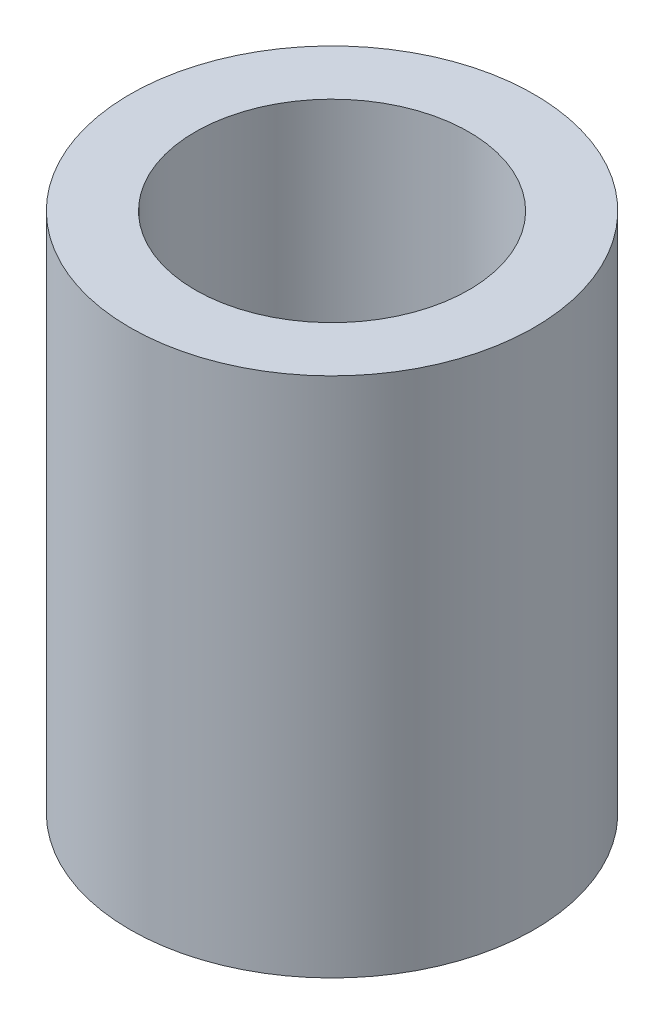
ISO-10303-21;
HEADER;
FILE_DESCRIPTION(('STEP AP214'),'2;1');
FILE_NAME('part.step','',(''),(''),'','','');
FILE_SCHEMA(('AUTOMOTIVE_DESIGN { 1 0 10303 214 1 1 1 1 }'));
ENDSEC;
DATA;
#1=APPLICATION_CONTEXT('core data for automotive mechanical design processes');
#2=APPLICATION_PROTOCOL_DEFINITION('international standard','automotive_design',2000,#1);
#3=PRODUCT_CONTEXT('',#1,'mechanical');
#4=PRODUCT('Part','Part','',(#3));
#5=PRODUCT_RELATED_PRODUCT_CATEGORY('part','',(#4));
#6=PRODUCT_DEFINITION_FORMATION('','',#4);
#7=PRODUCT_DEFINITION_CONTEXT('part definition',#1,'design');
#8=PRODUCT_DEFINITION('design','',#6,#7);
#9=PRODUCT_DEFINITION_SHAPE('','',#8);
#10=(LENGTH_UNIT() NAMED_UNIT(*) SI_UNIT(.MILLI.,.METRE.));
#11=(NAMED_UNIT(*) PLANE_ANGLE_UNIT() SI_UNIT($,.RADIAN.));
#12=(NAMED_UNIT(*) SI_UNIT($,.STERADIAN.) SOLID_ANGLE_UNIT());
#13=UNCERTAINTY_MEASURE_WITH_UNIT(LENGTH_MEASURE(1.E-05),#10,'distance_accuracy_value','');
#14=(GEOMETRIC_REPRESENTATION_CONTEXT(3) GLOBAL_UNCERTAINTY_ASSIGNED_CONTEXT((#13)) GLOBAL_UNIT_ASSIGNED_CONTEXT((#10,
#11,#12)) REPRESENTATION_CONTEXT('',''));
#15=CARTESIAN_POINT('',(0.,0.,0.));
#16=DIRECTION('',(0.,0.,1.));
#17=DIRECTION('',(1.,0.,0.));
#18=AXIS2_PLACEMENT_3D('',#15,#16,#17);
#19=CARTESIAN_POINT('',(0.,8.,0.));
#20=DIRECTION('',(0.,-1.,0.));
#21=DIRECTION('',(0.,0.,-1.));
#22=AXIS2_PLACEMENT_3D('',#19,#20,#21);
#23=CYLINDRICAL_SURFACE('',#22,3.1);
#24=CARTESIAN_POINT('',(0.,8.,0.));
#25=DIRECTION('',(0.,1.,0.));
#26=DIRECTION('',(0.,0.,1.));
#27=AXIS2_PLACEMENT_3D('',#24,#25,#26);
#28=CIRCLE('',#27,3.1);
#29=CARTESIAN_POINT('',(0.,8.,3.1));
#30=VERTEX_POINT('',#29);
#31=EDGE_CURVE('E10',#30,#30,#28,.T.);
#32=ORIENTED_EDGE('',*,*,#31,.F.);
#33=EDGE_LOOP('',(#32));
#34=FACE_BOUND('',#33,.T.);
#35=CARTESIAN_POINT('',(0.,0.,0.));
#36=DIRECTION('',(0.,1.,0.));
#37=DIRECTION('',(0.,0.,1.));
#38=AXIS2_PLACEMENT_3D('',#35,#36,#37);
#39=CIRCLE('',#38,3.1);
#40=CARTESIAN_POINT('',(0.,0.,3.1));
#41=VERTEX_POINT('',#40);
#42=EDGE_CURVE('E40',#41,#41,#39,.T.);
#43=ORIENTED_EDGE('',*,*,#42,.T.);
#44=EDGE_LOOP('',(#43));
#45=FACE_BOUND('',#44,.T.);
#46=ADVANCED_FACE('F37',(#34,#45),#23,.T.);
#47=CARTESIAN_POINT('',(0.,8.,0.));
#48=DIRECTION('',(0.,1.,0.));
#49=DIRECTION('',(0.,0.,1.));
#50=AXIS2_PLACEMENT_3D('',#47,#48,#49);
#51=PLANE('',#50);
#52=CARTESIAN_POINT('',(0.,8.,0.));
#53=DIRECTION('',(0.,1.,0.));
#54=DIRECTION('',(0.,0.,1.));
#55=AXIS2_PLACEMENT_3D('',#52,#53,#54);
#56=CIRCLE('',#55,2.1);
#57=CARTESIAN_POINT('',(0.,8.,2.1));
#58=VERTEX_POINT('',#57);
#59=EDGE_CURVE('E51',#58,#58,#56,.T.);
#60=ORIENTED_EDGE('',*,*,#59,.F.);
#61=EDGE_LOOP('',(#60));
#62=FACE_BOUND('',#61,.T.);
#63=ORIENTED_EDGE('',*,*,#31,.T.);
#64=EDGE_LOOP('',(#63));
#65=FACE_BOUND('',#64,.T.);
#66=ADVANCED_FACE('F68',(#62,#65),#51,.T.);
#67=CARTESIAN_POINT('',(0.,0.,0.));
#68=DIRECTION('',(0.,1.,0.));
#69=DIRECTION('',(0.,0.,1.));
#70=AXIS2_PLACEMENT_3D('',#67,#68,#69);
#71=PLANE('',#70);
#72=CARTESIAN_POINT('',(0.,0.,0.));
#73=DIRECTION('',(0.,1.,0.));
#74=DIRECTION('',(0.,0.,1.));
#75=AXIS2_PLACEMENT_3D('',#72,#73,#74);
#76=CIRCLE('',#75,2.1);
#77=CARTESIAN_POINT('',(0.,0.,2.1));
#78=VERTEX_POINT('',#77);
#79=EDGE_CURVE('E49',#78,#78,#76,.T.);
#80=ORIENTED_EDGE('',*,*,#79,.T.);
#81=EDGE_LOOP('',(#80));
#82=FACE_BOUND('',#81,.T.);
#83=ORIENTED_EDGE('',*,*,#42,.F.);
#84=EDGE_LOOP('',(#83));
#85=FACE_BOUND('',#84,.T.);
#86=ADVANCED_FACE('F59',(#82,#85),#71,.F.);
#87=CARTESIAN_POINT('',(0.,0.,0.));
#88=DIRECTION('',(0.,1.,0.));
#89=DIRECTION('',(0.,0.,1.));
#90=AXIS2_PLACEMENT_3D('',#87,#88,#89);
#91=CYLINDRICAL_SURFACE('',#90,2.1);
#92=ORIENTED_EDGE('',*,*,#79,.F.);
#93=EDGE_LOOP('',(#92));
#94=FACE_BOUND('',#93,.T.);
#95=ORIENTED_EDGE('',*,*,#59,.T.);
#96=EDGE_LOOP('',(#95));
#97=FACE_BOUND('',#96,.T.);
#98=ADVANCED_FACE('F62',(#94,#97),#91,.F.);
#99=CLOSED_SHELL('',(#46,#66,#86,#98));
#100=MANIFOLD_SOLID_BREP('B2',#99);
#101=ADVANCED_BREP_SHAPE_REPRESENTATION('',(#18,#100),#14);
#102=SHAPE_DEFINITION_REPRESENTATION(#9,#101);
ENDSEC;
END-ISO-10303-21;
